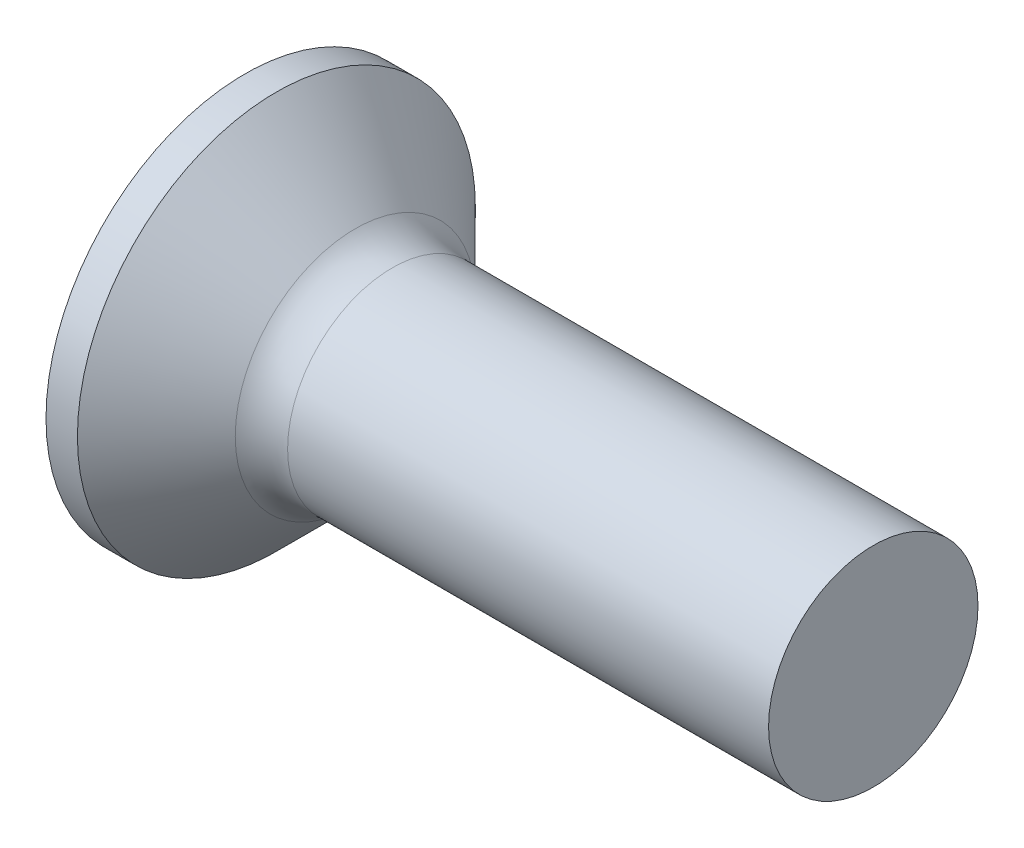
ISO-10303-21;
HEADER;
FILE_DESCRIPTION(('STEP AP214'),'2;1');
FILE_NAME('part.step','',(''),(''),'','','');
FILE_SCHEMA(('AUTOMOTIVE_DESIGN { 1 0 10303 214 1 1 1 1 }'));
ENDSEC;
DATA;
#1=APPLICATION_CONTEXT('core data for automotive mechanical design processes');
#2=APPLICATION_PROTOCOL_DEFINITION('international standard','automotive_design',2000,#1);
#3=PRODUCT_CONTEXT('',#1,'mechanical');
#4=PRODUCT('Part','Part','',(#3));
#5=PRODUCT_RELATED_PRODUCT_CATEGORY('part','',(#4));
#6=PRODUCT_DEFINITION_FORMATION('','',#4);
#7=PRODUCT_DEFINITION_CONTEXT('part definition',#1,'design');
#8=PRODUCT_DEFINITION('design','',#6,#7);
#9=PRODUCT_DEFINITION_SHAPE('','',#8);
#10=(LENGTH_UNIT() NAMED_UNIT(*) SI_UNIT(.MILLI.,.METRE.));
#11=(NAMED_UNIT(*) PLANE_ANGLE_UNIT() SI_UNIT($,.RADIAN.));
#12=(NAMED_UNIT(*) SI_UNIT($,.STERADIAN.) SOLID_ANGLE_UNIT());
#13=UNCERTAINTY_MEASURE_WITH_UNIT(LENGTH_MEASURE(1.E-05),#10,'distance_accuracy_value','');
#14=(GEOMETRIC_REPRESENTATION_CONTEXT(3) GLOBAL_UNCERTAINTY_ASSIGNED_CONTEXT((#13)) GLOBAL_UNIT_ASSIGNED_CONTEXT((#10,
#11,#12)) REPRESENTATION_CONTEXT('',''));
#15=CARTESIAN_POINT('',(0.,0.,0.));
#16=DIRECTION('',(0.,0.,1.));
#17=DIRECTION('',(1.,0.,0.));
#18=AXIS2_PLACEMENT_3D('',#15,#16,#17);
#19=CARTESIAN_POINT('',(0.,0.,0.));
#20=DIRECTION('',(-1.,0.,0.));
#21=DIRECTION('',(0.,0.,1.));
#22=AXIS2_PLACEMENT_3D('',#19,#20,#21);
#23=PLANE('',#22);
#24=CARTESIAN_POINT('',(0.,0.,0.));
#25=DIRECTION('',(-1.,0.,0.));
#26=DIRECTION('',(0.,0.,1.));
#27=AXIS2_PLACEMENT_3D('',#24,#25,#26);
#28=CIRCLE('',#27,1.9);
#29=CARTESIAN_POINT('',(0.,0.,1.9));
#30=VERTEX_POINT('',#29);
#31=EDGE_CURVE('E342',#30,#30,#28,.T.);
#32=ORIENTED_EDGE('',*,*,#31,.T.);
#33=EDGE_LOOP('',(#32));
#34=FACE_BOUND('',#33,.T.);
#35=DIRECTION('',(0.,0.,-1.));
#36=VECTOR('',#35,1.);
#37=CARTESIAN_POINT('',(0.,-0.240000000000003,0.95));
#38=LINE('',#37,#36);
#39=CARTESIAN_POINT('',(0.,-0.240000000000003,0.95));
#40=VERTEX_POINT('',#39);
#41=CARTESIAN_POINT('',(0.,-0.240000000000001,0.368080234393744));
#42=VERTEX_POINT('',#41);
#43=EDGE_CURVE('E381',#40,#42,#38,.T.);
#44=ORIENTED_EDGE('',*,*,#43,.T.);
#45=CARTESIAN_POINT('',(0.,0.,0.));
#46=DIRECTION('',(-1.,0.,0.));
#47=DIRECTION('',(0.,0.,1.));
#48=AXIS2_PLACEMENT_3D('',#45,#46,#47);
#49=CIRCLE('',#48,0.439412174332203);
#50=CARTESIAN_POINT('',(0.,-0.368080234393745,0.24));
#51=VERTEX_POINT('',#50);
#52=EDGE_CURVE('E368',#51,#42,#49,.T.);
#53=ORIENTED_EDGE('',*,*,#52,.F.);
#54=DIRECTION('',(0.,-1.,0.));
#55=VECTOR('',#54,1.);
#56=CARTESIAN_POINT('',(0.,0.95,0.24));
#57=LINE('',#56,#55);
#58=CARTESIAN_POINT('',(0.,-0.949999999999999,0.24));
#59=VERTEX_POINT('',#58);
#60=EDGE_CURVE('E428',#51,#59,#57,.T.);
#61=ORIENTED_EDGE('',*,*,#60,.T.);
#62=DIRECTION('',(0.,0.,-1.));
#63=VECTOR('',#62,1.);
#64=CARTESIAN_POINT('',(0.,-0.949999999999999,0.24));
#65=LINE('',#64,#63);
#66=CARTESIAN_POINT('',(0.,-0.949999999999999,-0.239999999999999));
#67=VERTEX_POINT('',#66);
#68=EDGE_CURVE('E339',#59,#67,#65,.T.);
#69=ORIENTED_EDGE('',*,*,#68,.T.);
#70=DIRECTION('',(0.,1.,0.));
#71=VECTOR('',#70,1.);
#72=CARTESIAN_POINT('',(0.,-0.949999999999999,-0.239999999999999));
#73=LINE('',#72,#71);
#74=CARTESIAN_POINT('',(0.,-0.368080234393745,-0.239999999999999));
#75=VERTEX_POINT('',#74);
#76=EDGE_CURVE('E429',#67,#75,#73,.T.);
#77=ORIENTED_EDGE('',*,*,#76,.T.);
#78=CARTESIAN_POINT('',(0.,-0.239999999999999,-0.368080234393746));
#79=VERTEX_POINT('',#78);
#80=EDGE_CURVE('E374',#79,#75,#49,.T.);
#81=ORIENTED_EDGE('',*,*,#80,.F.);
#82=CARTESIAN_POINT('',(0.,-0.239999999999997,-0.95));
#83=VERTEX_POINT('',#82);
#84=EDGE_CURVE('E390',#79,#83,#38,.T.);
#85=ORIENTED_EDGE('',*,*,#84,.T.);
#86=DIRECTION('',(0.,1.,0.));
#87=VECTOR('',#86,1.);
#88=CARTESIAN_POINT('',(0.,-0.239999999999997,-0.95));
#89=LINE('',#88,#87);
#90=CARTESIAN_POINT('',(0.,0.240000000000003,-0.949999999999998));
#91=VERTEX_POINT('',#90);
#92=EDGE_CURVE('E389',#83,#91,#89,.T.);
#93=ORIENTED_EDGE('',*,*,#92,.T.);
#94=DIRECTION('',(0.,0.,1.));
#95=VECTOR('',#94,1.);
#96=CARTESIAN_POINT('',(0.,0.240000000000003,-0.949999999999998));
#97=LINE('',#96,#95);
#98=CARTESIAN_POINT('',(0.,0.240000000000001,-0.368080234393744));
#99=VERTEX_POINT('',#98);
#100=EDGE_CURVE('E396',#91,#99,#97,.T.);
#101=ORIENTED_EDGE('',*,*,#100,.T.);
#102=CARTESIAN_POINT('',(0.,0.368080234393745,-0.239999999999999));
#103=VERTEX_POINT('',#102);
#104=EDGE_CURVE('E464',#103,#99,#49,.T.);
#105=ORIENTED_EDGE('',*,*,#104,.F.);
#106=CARTESIAN_POINT('',(0.,0.95,-0.239999999999999));
#107=VERTEX_POINT('',#106);
#108=EDGE_CURVE('E437',#103,#107,#73,.T.);
#109=ORIENTED_EDGE('',*,*,#108,.T.);
#110=DIRECTION('',(0.,0.,1.));
#111=VECTOR('',#110,1.);
#112=CARTESIAN_POINT('',(0.,0.95,-0.239999999999999));
#113=LINE('',#112,#111);
#114=CARTESIAN_POINT('',(0.,0.95,0.24));
#115=VERTEX_POINT('',#114);
#116=EDGE_CURVE('E425',#107,#115,#113,.T.);
#117=ORIENTED_EDGE('',*,*,#116,.T.);
#118=CARTESIAN_POINT('',(0.,0.368080234393745,0.24));
#119=VERTEX_POINT('',#118);
#120=EDGE_CURVE('E430',#115,#119,#57,.T.);
#121=ORIENTED_EDGE('',*,*,#120,.T.);
#122=CARTESIAN_POINT('',(0.,0.239999999999998,0.368080234393746));
#123=VERTEX_POINT('',#122);
#124=EDGE_CURVE('E376',#123,#119,#49,.T.);
#125=ORIENTED_EDGE('',*,*,#124,.F.);
#126=CARTESIAN_POINT('',(0.,0.239999999999996,0.950000000000001));
#127=VERTEX_POINT('',#126);
#128=EDGE_CURVE('E399',#123,#127,#97,.T.);
#129=ORIENTED_EDGE('',*,*,#128,.T.);
#130=DIRECTION('',(0.,-1.,0.));
#131=VECTOR('',#130,1.);
#132=CARTESIAN_POINT('',(0.,0.239999999999996,0.950000000000001));
#133=LINE('',#132,#131);
#134=EDGE_CURVE('E388',#127,#40,#133,.T.);
#135=ORIENTED_EDGE('',*,*,#134,.T.);
#136=EDGE_LOOP('',(#44,#53,#61,#69,#77,#81,#85,#93,#101,#105,#109,#117,#121,#125,#129,#135));
#137=FACE_BOUND('',#136,.T.);
#138=ADVANCED_FACE('F35',(#34,#137),#23,.T.);
#139=CARTESIAN_POINT('',(1.2,-0.35170209098021,0.24));
#140=DIRECTION('',(0.,0.,-1.));
#141=DIRECTION('',(-1.,0.,0.));
#142=AXIS2_PLACEMENT_3D('',#139,#140,#141);
#143=PLANE('',#142);
#144=ORIENTED_EDGE('',*,*,#60,.F.);
#145=CARTESIAN_POINT('',(-0.647693210410766,-0.421114336989015,0.24));
#146=CARTESIAN_POINT('',(-0.514503449530111,-0.410390261082206,0.24));
#147=CARTESIAN_POINT('',(-0.381320940222105,-0.399574318209683,0.24));
#148=CARTESIAN_POINT('',(-0.114973765651316,-0.377686644383827,0.24));
#149=CARTESIAN_POINT('',(0.0181908991098696,-0.36661490733336,0.24));
#150=CARTESIAN_POINT('',(0.284492634009301,-0.344144100394437,0.24));
#151=CARTESIAN_POINT('',(0.417629704158519,-0.332745030636382,0.24));
#152=CARTESIAN_POINT('',(0.683863247571634,-0.309504122508586,0.24));
#153=CARTESIAN_POINT('',(0.816959721449588,-0.297662291208839,0.24));
#154=CARTESIAN_POINT('',(1.04303435436914,-0.277010154535522,0.24));
#155=CARTESIAN_POINT('',(1.13602713244054,-0.268360479227262,0.24));
#156=CARTESIAN_POINT('',(1.32197255818582,-0.250648380042692,0.24));
#157=CARTESIAN_POINT('',(1.41492520621454,-0.241585959894734,0.24));
#158=CARTESIAN_POINT('',(1.60078125424125,-0.222904447219643,0.24));
#159=CARTESIAN_POINT('',(1.69368465085292,-0.213285320436498,0.24));
#160=CARTESIAN_POINT('',(1.8793987441832,-0.193166747196933,0.24));
#161=CARTESIAN_POINT('',(1.97220943765284,-0.182667270911613,0.24));
#162=CARTESIAN_POINT('',(2.06495176785102,-0.171565852394699,0.24));
#163=B_SPLINE_CURVE_WITH_KNOTS('',3,(#145,#146,#147,#148,#149,#150,#151,#152,#153,#154,#155,
#156,#157,#158,#159,#160,#161,#162),.UNSPECIFIED.,.F.,.F.,(4,2,2,2,2,2,2,2,4),(0.,
0.400862588720512,0.801734742318302,1.20260673621982,1.60347233174809,1.88365413958718,
2.16383341702737,2.44402995319874,2.72423598711459),.UNSPECIFIED.);
#164=CARTESIAN_POINT('',(1.2,-0.262259890185287,0.240000000000001));
#165=VERTEX_POINT('',#164);
#166=EDGE_CURVE('E371',#51,#165,#163,.T.);
#167=ORIENTED_EDGE('',*,*,#166,.T.);
#168=DIRECTION('',(0.,-1.,0.));
#169=VECTOR('',#168,1.);
#170=CARTESIAN_POINT('',(1.2,0.351702090980209,0.24));
#171=LINE('',#170,#169);
#172=CARTESIAN_POINT('',(1.2,-0.35170209098021,0.24));
#173=VERTEX_POINT('',#172);
#174=EDGE_CURVE('E444',#165,#173,#171,.T.);
#175=ORIENTED_EDGE('',*,*,#174,.T.);
#176=DIRECTION('',(0.894934367749961,0.446197800778957,0.));
#177=VECTOR('',#176,1.);
#178=CARTESIAN_POINT('',(0.,-0.949999999999999,0.24));
#179=LINE('',#178,#177);
#180=EDGE_CURVE('E317',#59,#173,#179,.T.);
#181=ORIENTED_EDGE('',*,*,#180,.F.);
#182=EDGE_LOOP('',(#144,#167,#175,#181));
#183=FACE_BOUND('',#182,.T.);
#184=ADVANCED_FACE('F189',(#183),#143,.T.);
#185=CARTESIAN_POINT('',(1.2,0.351702090980209,0.24));
#186=VERTEX_POINT('',#185);
#187=CARTESIAN_POINT('',(1.2,0.262259890185287,0.240000000000001));
#188=VERTEX_POINT('',#187);
#189=EDGE_CURVE('E326',#186,#188,#171,.T.);
#190=ORIENTED_EDGE('',*,*,#189,.T.);
#191=CARTESIAN_POINT('',(-0.647693210410766,0.421114336989016,0.24));
#192=CARTESIAN_POINT('',(-0.514503449530111,0.410390261082206,0.24));
#193=CARTESIAN_POINT('',(-0.381320940222105,0.399574318209683,0.24));
#194=CARTESIAN_POINT('',(-0.114973765651316,0.377686644383827,0.24));
#195=CARTESIAN_POINT('',(0.01819089910987,0.36661490733336,0.24));
#196=CARTESIAN_POINT('',(0.284492634009302,0.344144100394437,0.24));
#197=CARTESIAN_POINT('',(0.417629704158519,0.332745030636382,0.24));
#198=CARTESIAN_POINT('',(0.683863247571635,0.309504122508586,0.24));
#199=CARTESIAN_POINT('',(0.816959721449588,0.29766229120884,0.24));
#200=CARTESIAN_POINT('',(1.04303435436914,0.277010154535522,0.24));
#201=CARTESIAN_POINT('',(1.13602713244054,0.268360479227262,0.24));
#202=CARTESIAN_POINT('',(1.32197255818582,0.250648380042692,0.24));
#203=CARTESIAN_POINT('',(1.41492520621454,0.241585959894734,0.24));
#204=CARTESIAN_POINT('',(1.60078125424125,0.222904447219643,0.24));
#205=CARTESIAN_POINT('',(1.69368465085292,0.213285320436498,0.24));
#206=CARTESIAN_POINT('',(1.8793987441832,0.193166747196933,0.24));
#207=CARTESIAN_POINT('',(1.97220943765284,0.182667270911613,0.24));
#208=CARTESIAN_POINT('',(2.06495176785102,0.171565852394699,0.24));
#209=B_SPLINE_CURVE_WITH_KNOTS('',3,(#191,#192,#193,#194,#195,#196,#197,#198,#199,#200,#201,
#202,#203,#204,#205,#206,#207,#208),.UNSPECIFIED.,.F.,.F.,(4,2,2,2,2,2,2,2,4),(0.,
0.400862588720512,0.801734742318302,1.20260673621982,1.60347233174809,1.88365413958718,
2.16383341702737,2.44402995319874,2.72423598711459),.UNSPECIFIED.);
#210=EDGE_CURVE('E249',#188,#119,#209,.F.);
#211=ORIENTED_EDGE('',*,*,#210,.T.);
#212=ORIENTED_EDGE('',*,*,#120,.F.);
#213=DIRECTION('',(0.89493436774996,-0.446197800778958,0.));
#214=VECTOR('',#213,1.);
#215=CARTESIAN_POINT('',(0.,0.95,0.24));
#216=LINE('',#215,#214);
#217=EDGE_CURVE('E58',#115,#186,#216,.T.);
#218=ORIENTED_EDGE('',*,*,#217,.T.);
#219=EDGE_LOOP('',(#190,#211,#212,#218));
#220=FACE_BOUND('',#219,.T.);
#221=ADVANCED_FACE('F194',(#220),#143,.T.);
#222=CARTESIAN_POINT('',(1.2,0.351702090980209,-0.24));
#223=DIRECTION('',(0.,0.,1.));
#224=DIRECTION('',(1.,0.,0.));
#225=AXIS2_PLACEMENT_3D('',#222,#223,#224);
#226=PLANE('',#225);
#227=DIRECTION('',(0.,1.,0.));
#228=VECTOR('',#227,1.);
#229=CARTESIAN_POINT('',(1.2,-0.35170209098021,-0.24));
#230=LINE('',#229,#228);
#231=CARTESIAN_POINT('',(1.2,-0.35170209098021,-0.24));
#232=VERTEX_POINT('',#231);
#233=CARTESIAN_POINT('',(1.2,-0.262259890185287,-0.24));
#234=VERTEX_POINT('',#233);
#235=EDGE_CURVE('E330',#232,#234,#230,.T.);
#236=ORIENTED_EDGE('',*,*,#235,.T.);
#237=CARTESIAN_POINT('',(-0.647693210410766,-0.421114336989016,-0.239999999999999));
#238=CARTESIAN_POINT('',(-0.514503449530111,-0.410390261082207,-0.239999999999999));
#239=CARTESIAN_POINT('',(-0.381320940222105,-0.399574318209683,-0.239999999999999));
#240=CARTESIAN_POINT('',(-0.114973765651316,-0.377686644383827,-0.239999999999999));
#241=CARTESIAN_POINT('',(0.0181908991098698,-0.36661490733336,-0.239999999999999));
#242=CARTESIAN_POINT('',(0.284492634009301,-0.344144100394437,-0.239999999999999));
#243=CARTESIAN_POINT('',(0.417629704158519,-0.332745030636383,-0.24));
#244=CARTESIAN_POINT('',(0.683863247571635,-0.309504122508587,-0.24));
#245=CARTESIAN_POINT('',(0.816959721449588,-0.29766229120884,-0.24));
#246=CARTESIAN_POINT('',(1.04303435436914,-0.277010154535522,-0.24));
#247=CARTESIAN_POINT('',(1.13602713244054,-0.268360479227262,-0.24));
#248=CARTESIAN_POINT('',(1.32197255818582,-0.250648380042692,-0.24));
#249=CARTESIAN_POINT('',(1.41492520621454,-0.241585959894734,-0.24));
#250=CARTESIAN_POINT('',(1.60078125424125,-0.222904447219643,-0.24));
#251=CARTESIAN_POINT('',(1.69368465085292,-0.213285320436498,-0.24));
#252=CARTESIAN_POINT('',(1.8793987441832,-0.193166747196933,-0.24));
#253=CARTESIAN_POINT('',(1.97220943765284,-0.182667270911613,-0.24));
#254=CARTESIAN_POINT('',(2.06495176785102,-0.171565852394699,-0.24));
#255=B_SPLINE_CURVE_WITH_KNOTS('',3,(#237,#238,#239,#240,#241,#242,#243,#244,#245,#246,#247,
#248,#249,#250,#251,#252,#253,#254),.UNSPECIFIED.,.F.,.F.,(4,2,2,2,2,2,2,2,4),(0.,
0.400862588720512,0.801734742318302,1.20260673621982,1.60347233174809,1.88365413958718,
2.16383341702737,2.44402995319874,2.72423598711459),.UNSPECIFIED.);
#256=EDGE_CURVE('E243',#234,#75,#255,.F.);
#257=ORIENTED_EDGE('',*,*,#256,.T.);
#258=ORIENTED_EDGE('',*,*,#76,.F.);
#259=DIRECTION('',(0.894934367749961,0.446197800778957,0.));
#260=VECTOR('',#259,1.);
#261=CARTESIAN_POINT('',(0.,-0.949999999999999,-0.239999999999999));
#262=LINE('',#261,#260);
#263=EDGE_CURVE('E439',#67,#232,#262,.T.);
#264=ORIENTED_EDGE('',*,*,#263,.T.);
#265=EDGE_LOOP('',(#236,#257,#258,#264));
#266=FACE_BOUND('',#265,.T.);
#267=ADVANCED_FACE('F229',(#266),#226,.T.);
#268=ORIENTED_EDGE('',*,*,#108,.F.);
#269=CARTESIAN_POINT('',(-0.647693210410766,0.421114336989016,-0.239999999999999));
#270=CARTESIAN_POINT('',(-0.514503449530111,0.410390261082207,-0.239999999999999));
#271=CARTESIAN_POINT('',(-0.381320940222105,0.399574318209683,-0.239999999999999));
#272=CARTESIAN_POINT('',(-0.114973765651316,0.377686644383827,-0.239999999999999));
#273=CARTESIAN_POINT('',(0.0181908991098698,0.36661490733336,-0.239999999999999));
#274=CARTESIAN_POINT('',(0.284492634009301,0.344144100394437,-0.239999999999999));
#275=CARTESIAN_POINT('',(0.417629704158519,0.332745030636383,-0.24));
#276=CARTESIAN_POINT('',(0.683863247571635,0.309504122508587,-0.24));
#277=CARTESIAN_POINT('',(0.816959721449588,0.29766229120884,-0.24));
#278=CARTESIAN_POINT('',(1.04303435436914,0.277010154535523,-0.24));
#279=CARTESIAN_POINT('',(1.13602713244054,0.268360479227262,-0.24));
#280=CARTESIAN_POINT('',(1.32197255818582,0.250648380042692,-0.24));
#281=CARTESIAN_POINT('',(1.41492520621454,0.241585959894734,-0.24));
#282=CARTESIAN_POINT('',(1.60078125424125,0.222904447219643,-0.24));
#283=CARTESIAN_POINT('',(1.69368465085292,0.213285320436498,-0.24));
#284=CARTESIAN_POINT('',(1.8793987441832,0.193166747196933,-0.24));
#285=CARTESIAN_POINT('',(1.97220943765284,0.182667270911613,-0.24));
#286=CARTESIAN_POINT('',(2.06495176785102,0.171565852394699,-0.24));
#287=B_SPLINE_CURVE_WITH_KNOTS('',3,(#269,#270,#271,#272,#273,#274,#275,#276,#277,#278,#279,
#280,#281,#282,#283,#284,#285,#286),.UNSPECIFIED.,.F.,.F.,(4,2,2,2,2,2,2,2,4),(0.,
0.400862588720512,0.801734742318302,1.20260673621982,1.60347233174809,1.88365413958718,
2.16383341702737,2.44402995319874,2.72423598711459),.UNSPECIFIED.);
#288=CARTESIAN_POINT('',(1.2,0.262259890185287,-0.24));
#289=VERTEX_POINT('',#288);
#290=EDGE_CURVE('E237',#103,#289,#287,.T.);
#291=ORIENTED_EDGE('',*,*,#290,.T.);
#292=CARTESIAN_POINT('',(1.2,0.351702090980209,-0.24));
#293=VERTEX_POINT('',#292);
#294=EDGE_CURVE('E334',#289,#293,#230,.T.);
#295=ORIENTED_EDGE('',*,*,#294,.T.);
#296=DIRECTION('',(0.89493436774996,-0.446197800778958,0.));
#297=VECTOR('',#296,1.);
#298=CARTESIAN_POINT('',(0.,0.95,-0.239999999999999));
#299=LINE('',#298,#297);
#300=EDGE_CURVE('E321',#107,#293,#299,.T.);
#301=ORIENTED_EDGE('',*,*,#300,.F.);
#302=EDGE_LOOP('',(#268,#291,#295,#301));
#303=FACE_BOUND('',#302,.T.);
#304=ADVANCED_FACE('F221',(#303),#226,.T.);
#305=CARTESIAN_POINT('',(1.2,0.351702090980209,-0.24));
#306=DIRECTION('',(1.,0.,0.));
#307=DIRECTION('',(0.,0.,-1.));
#308=AXIS2_PLACEMENT_3D('',#305,#306,#307);
#309=PLANE('',#308);
#310=CARTESIAN_POINT('',(1.2,0.,0.));
#311=DIRECTION('',(-1.,0.,0.));
#312=DIRECTION('',(0.,0.,1.));
#313=AXIS2_PLACEMENT_3D('',#310,#311,#312);
#314=CIRCLE('',#313,0.355499999999999);
#315=CARTESIAN_POINT('',(1.2,-0.0518255651213496,-0.35170209098021));
#316=VERTEX_POINT('',#315);
#317=CARTESIAN_POINT('',(1.2,-0.239999999999999,-0.262259890185288));
#318=VERTEX_POINT('',#317);
#319=EDGE_CURVE('E511',#316,#318,#314,.T.);
#320=ORIENTED_EDGE('',*,*,#319,.F.);
#321=DIRECTION('',(0.,1.,0.));
#322=VECTOR('',#321,1.);
#323=CARTESIAN_POINT('',(1.2,-0.239999999999999,-0.35170209098021));
#324=LINE('',#323,#322);
#325=CARTESIAN_POINT('',(1.2,-0.239999999999999,-0.35170209098021));
#326=VERTEX_POINT('',#325);
#327=EDGE_CURVE('E411',#326,#316,#324,.T.);
#328=ORIENTED_EDGE('',*,*,#327,.F.);
#329=DIRECTION('',(0.,0.,-1.));
#330=VECTOR('',#329,1.);
#331=CARTESIAN_POINT('',(1.2,-0.240000000000001,0.351702090980208));
#332=LINE('',#331,#330);
#333=EDGE_CURVE('E415',#318,#326,#332,.T.);
#334=ORIENTED_EDGE('',*,*,#333,.F.);
#335=EDGE_LOOP('',(#320,#328,#334));
#336=FACE_BOUND('',#335,.T.);
#337=ADVANCED_FACE('F217',(#336),#309,.F.);
#338=CARTESIAN_POINT('',(1.2,-0.35170209098021,-0.0518255651213508));
#339=VERTEX_POINT('',#338);
#340=EDGE_CURVE('E482',#234,#339,#314,.T.);
#341=ORIENTED_EDGE('',*,*,#340,.F.);
#342=ORIENTED_EDGE('',*,*,#235,.F.);
#343=DIRECTION('',(0.,0.,-1.));
#344=VECTOR('',#343,1.);
#345=CARTESIAN_POINT('',(1.2,-0.35170209098021,0.24));
#346=LINE('',#345,#344);
#347=EDGE_CURVE('E322',#339,#232,#346,.T.);
#348=ORIENTED_EDGE('',*,*,#347,.F.);
#349=EDGE_LOOP('',(#341,#342,#348));
#350=FACE_BOUND('',#349,.T.);
#351=ADVANCED_FACE('F220',(#350),#309,.F.);
#352=CARTESIAN_POINT('',(1.2,-0.35170209098021,0.0518255651213508));
#353=VERTEX_POINT('',#352);
#354=EDGE_CURVE('E478',#353,#165,#314,.T.);
#355=ORIENTED_EDGE('',*,*,#354,.F.);
#356=EDGE_CURVE('E312',#173,#353,#346,.T.);
#357=ORIENTED_EDGE('',*,*,#356,.F.);
#358=ORIENTED_EDGE('',*,*,#174,.F.);
#359=EDGE_LOOP('',(#355,#357,#358));
#360=FACE_BOUND('',#359,.T.);
#361=ADVANCED_FACE('F476',(#360),#309,.F.);
#362=CARTESIAN_POINT('',(1.2,-0.240000000000001,0.262259890185287));
#363=VERTEX_POINT('',#362);
#364=CARTESIAN_POINT('',(1.2,-0.0518255651213507,0.351702090980209));
#365=VERTEX_POINT('',#364);
#366=EDGE_CURVE('E50',#363,#365,#314,.T.);
#367=ORIENTED_EDGE('',*,*,#366,.F.);
#368=CARTESIAN_POINT('',(1.2,-0.240000000000001,0.351702090980208));
#369=VERTEX_POINT('',#368);
#370=EDGE_CURVE('E384',#369,#363,#332,.T.);
#371=ORIENTED_EDGE('',*,*,#370,.F.);
#372=DIRECTION('',(0.,-1.,0.));
#373=VECTOR('',#372,1.);
#374=CARTESIAN_POINT('',(1.2,0.239999999999999,0.35170209098021));
#375=LINE('',#374,#373);
#376=EDGE_CURVE('E416',#365,#369,#375,.T.);
#377=ORIENTED_EDGE('',*,*,#376,.F.);
#378=EDGE_LOOP('',(#367,#371,#377));
#379=FACE_BOUND('',#378,.T.);
#380=ADVANCED_FACE('F522',(#379),#309,.F.);
#381=CARTESIAN_POINT('',(1.2,0.0518255651213529,0.351702090980209));
#382=VERTEX_POINT('',#381);
#383=CARTESIAN_POINT('',(1.2,0.239999999999999,0.262259890185289));
#384=VERTEX_POINT('',#383);
#385=EDGE_CURVE('E375',#382,#384,#314,.T.);
#386=ORIENTED_EDGE('',*,*,#385,.F.);
#387=CARTESIAN_POINT('',(1.2,0.239999999999999,0.35170209098021));
#388=VERTEX_POINT('',#387);
#389=EDGE_CURVE('E412',#388,#382,#375,.T.);
#390=ORIENTED_EDGE('',*,*,#389,.F.);
#391=DIRECTION('',(0.,0.,1.));
#392=VECTOR('',#391,1.);
#393=CARTESIAN_POINT('',(1.2,0.240000000000001,-0.351702090980209));
#394=LINE('',#393,#392);
#395=EDGE_CURVE('E424',#384,#388,#394,.T.);
#396=ORIENTED_EDGE('',*,*,#395,.F.);
#397=EDGE_LOOP('',(#386,#390,#396));
#398=FACE_BOUND('',#397,.T.);
#399=ADVANCED_FACE('F487',(#398),#309,.F.);
#400=CARTESIAN_POINT('',(1.2,0.351702090980209,0.0518255651213541));
#401=VERTEX_POINT('',#400);
#402=EDGE_CURVE('E456',#188,#401,#314,.T.);
#403=ORIENTED_EDGE('',*,*,#402,.F.);
#404=ORIENTED_EDGE('',*,*,#189,.F.);
#405=DIRECTION('',(0.,0.,1.));
#406=VECTOR('',#405,1.);
#407=CARTESIAN_POINT('',(1.2,0.351702090980209,-0.24));
#408=LINE('',#407,#406);
#409=EDGE_CURVE('E333',#401,#186,#408,.T.);
#410=ORIENTED_EDGE('',*,*,#409,.F.);
#411=EDGE_LOOP('',(#403,#404,#410));
#412=FACE_BOUND('',#411,.T.);
#413=ADVANCED_FACE('F454',(#412),#309,.F.);
#414=CARTESIAN_POINT('',(1.2,0.351702090980209,-0.0518255651213541));
#415=VERTEX_POINT('',#414);
#416=EDGE_CURVE('E462',#415,#289,#314,.T.);
#417=ORIENTED_EDGE('',*,*,#416,.F.);
#418=EDGE_CURVE('E442',#293,#415,#408,.T.);
#419=ORIENTED_EDGE('',*,*,#418,.F.);
#420=ORIENTED_EDGE('',*,*,#294,.F.);
#421=EDGE_LOOP('',(#417,#419,#420));
#422=FACE_BOUND('',#421,.T.);
#423=ADVANCED_FACE('F306',(#422),#309,.F.);
#424=CARTESIAN_POINT('',(1.2,0.240000000000001,-0.262259890185287));
#425=VERTEX_POINT('',#424);
#426=CARTESIAN_POINT('',(1.2,0.051825565121352,-0.35170209098021));
#427=VERTEX_POINT('',#426);
#428=EDGE_CURVE('E505',#425,#427,#314,.T.);
#429=ORIENTED_EDGE('',*,*,#428,.F.);
#430=CARTESIAN_POINT('',(1.2,0.240000000000001,-0.351702090980209));
#431=VERTEX_POINT('',#430);
#432=EDGE_CURVE('E421',#431,#425,#394,.T.);
#433=ORIENTED_EDGE('',*,*,#432,.F.);
#434=EDGE_CURVE('E418',#427,#431,#324,.T.);
#435=ORIENTED_EDGE('',*,*,#434,.F.);
#436=EDGE_LOOP('',(#429,#433,#435));
#437=FACE_BOUND('',#436,.T.);
#438=ADVANCED_FACE('F223',(#437),#309,.F.);
#439=CARTESIAN_POINT('',(1.2,-0.35170209098021,-0.24));
#440=DIRECTION('',(-0.446197800778957,0.894934367749961,0.));
#441=DIRECTION('',(-0.894934367749961,-0.446197800778957,0.));
#442=AXIS2_PLACEMENT_3D('',#439,#440,#441);
#443=PLANE('',#442);
#444=ORIENTED_EDGE('',*,*,#356,.T.);
#445=CARTESIAN_POINT('',(1.81755030037573,-0.0438028797890923,0.));
#446=DIRECTION('',(-0.446197800778957,0.894934367749961,0.));
#447=DIRECTION('',(-0.894934367749961,-0.446197800778957,0.));
#448=AXIS2_PLACEMENT_3D('',#445,#446,#447);
#449=ELLIPSE('',#448,0.699951178008363,0.309229710740658);
#450=EDGE_CURVE('E313',#353,#339,#449,.F.);
#451=ORIENTED_EDGE('',*,*,#450,.T.);
#452=ORIENTED_EDGE('',*,*,#347,.T.);
#453=ORIENTED_EDGE('',*,*,#263,.F.);
#454=ORIENTED_EDGE('',*,*,#68,.F.);
#455=ORIENTED_EDGE('',*,*,#180,.T.);
#456=EDGE_LOOP('',(#444,#451,#452,#453,#454,#455));
#457=FACE_BOUND('',#456,.T.);
#458=ADVANCED_FACE('F228',(#457),#443,.T.);
#459=CARTESIAN_POINT('',(0.,0.95,0.24));
#460=DIRECTION('',(-0.446197800778958,-0.89493436774996,0.));
#461=DIRECTION('',(0.89493436774996,-0.446197800778958,0.));
#462=AXIS2_PLACEMENT_3D('',#459,#460,#461);
#463=PLANE('',#462);
#464=ORIENTED_EDGE('',*,*,#418,.T.);
#465=CARTESIAN_POINT('',(1.81755030037572,0.0438028797890925,0.));
#466=DIRECTION('',(-0.446197800778958,-0.89493436774996,0.));
#467=DIRECTION('',(-0.89493436774996,0.446197800778958,0.));
#468=AXIS2_PLACEMENT_3D('',#465,#466,#467);
#469=ELLIPSE('',#468,0.699951178008361,0.309229710740658);
#470=EDGE_CURVE('E290',#415,#401,#469,.F.);
#471=ORIENTED_EDGE('',*,*,#470,.T.);
#472=ORIENTED_EDGE('',*,*,#409,.T.);
#473=ORIENTED_EDGE('',*,*,#217,.F.);
#474=ORIENTED_EDGE('',*,*,#116,.F.);
#475=ORIENTED_EDGE('',*,*,#300,.T.);
#476=EDGE_LOOP('',(#464,#471,#472,#473,#474,#475));
#477=FACE_BOUND('',#476,.T.);
#478=ADVANCED_FACE('F224',(#477),#463,.T.);
#479=CARTESIAN_POINT('',(1.2,0.239999999999999,0.35170209098021));
#480=DIRECTION('',(0.,-1.,0.));
#481=DIRECTION('',(1.,0.,0.));
#482=AXIS2_PLACEMENT_3D('',#479,#480,#481);
#483=PLANE('',#482);
#484=ORIENTED_EDGE('',*,*,#432,.T.);
#485=CARTESIAN_POINT('',(-0.647693210410766,0.24,-0.421114336989015));
#486=CARTESIAN_POINT('',(-0.514503449530111,0.24,-0.410390261082206));
#487=CARTESIAN_POINT('',(-0.381320940222105,0.240000000000001,-0.399574318209682));
#488=CARTESIAN_POINT('',(-0.114973765651316,0.240000000000001,-0.377686644383827));
#489=CARTESIAN_POINT('',(0.0181908991098697,0.240000000000001,-0.36661490733336));
#490=CARTESIAN_POINT('',(0.284492634009301,0.240000000000001,-0.344144100394436));
#491=CARTESIAN_POINT('',(0.417629704158519,0.240000000000001,-0.332745030636382));
#492=CARTESIAN_POINT('',(0.683863247571635,0.240000000000001,-0.309504122508586));
#493=CARTESIAN_POINT('',(0.816959721449588,0.240000000000001,-0.297662291208839));
#494=CARTESIAN_POINT('',(1.04303435436914,0.240000000000001,-0.277010154535522));
#495=CARTESIAN_POINT('',(1.13602713244054,0.240000000000001,-0.268360479227261));
#496=CARTESIAN_POINT('',(1.32197255818582,0.240000000000001,-0.250648380042692));
#497=CARTESIAN_POINT('',(1.41492520621454,0.240000000000001,-0.241585959894734));
#498=CARTESIAN_POINT('',(1.60078125424125,0.240000000000001,-0.222904447219642));
#499=CARTESIAN_POINT('',(1.69368465085292,0.240000000000001,-0.213285320436497));
#500=CARTESIAN_POINT('',(1.8793987441832,0.240000000000001,-0.193166747196932));
#501=CARTESIAN_POINT('',(1.97220943765284,0.240000000000001,-0.182667270911612));
#502=CARTESIAN_POINT('',(2.06495176785102,0.240000000000001,-0.171565852394698));
#503=B_SPLINE_CURVE_WITH_KNOTS('',3,(#485,#486,#487,#488,#489,#490,#491,#492,#493,#494,#495,
#496,#497,#498,#499,#500,#501,#502),.UNSPECIFIED.,.F.,.F.,(4,2,2,2,2,2,2,2,4),(0.,
0.400862588720512,0.801734742318302,1.20260673621982,1.60347233174809,1.88365413958718,
2.16383341702737,2.44402995319874,2.72423598711459),.UNSPECIFIED.);
#504=EDGE_CURVE('E283',#425,#99,#503,.F.);
#505=ORIENTED_EDGE('',*,*,#504,.T.);
#506=ORIENTED_EDGE('',*,*,#100,.F.);
#507=DIRECTION('',(0.894934367749961,0.,0.446197800778957));
#508=VECTOR('',#507,1.);
#509=CARTESIAN_POINT('',(0.,0.240000000000003,-0.949999999999998));
#510=LINE('',#509,#508);
#511=EDGE_CURVE('E403',#91,#431,#510,.T.);
#512=ORIENTED_EDGE('',*,*,#511,.T.);
#513=EDGE_LOOP('',(#484,#505,#506,#512));
#514=FACE_BOUND('',#513,.T.);
#515=ADVANCED_FACE('F227',(#514),#483,.T.);
#516=CARTESIAN_POINT('',(1.2,-0.239999999999999,-0.35170209098021));
#517=DIRECTION('',(0.,1.,0.));
#518=DIRECTION('',(-1.,0.,0.));
#519=AXIS2_PLACEMENT_3D('',#516,#517,#518);
#520=PLANE('',#519);
#521=ORIENTED_EDGE('',*,*,#84,.F.);
#522=CARTESIAN_POINT('',(-0.647693210421637,-0.239999999999998,-0.421114336989891));
#523=CARTESIAN_POINT('',(-0.514503449539821,-0.239999999999998,-0.410390261082994));
#524=CARTESIAN_POINT('',(-0.381320940230653,-0.239999999999999,-0.399574318210382));
#525=CARTESIAN_POINT('',(-0.114973765657541,-0.239999999999999,-0.377686644384344));
#526=CARTESIAN_POINT('',(0.0181908991048066,-0.239999999999999,-0.366614907333785));
#527=CARTESIAN_POINT('',(0.284492634007953,-0.239999999999999,-0.344144100394555));
#528=CARTESIAN_POINT('',(0.417629704159725,-0.239999999999999,-0.332745030636282));
#529=CARTESIAN_POINT('',(0.683863247577946,-0.239999999999999,-0.309504122508032));
#530=CARTESIAN_POINT('',(0.81695972145845,-0.239999999999999,-0.297662291208049));
#531=CARTESIAN_POINT('',(1.04303435438055,-0.239999999999999,-0.277010154534468));
#532=CARTESIAN_POINT('',(1.13602713245195,-0.239999999999999,-0.268360479226193));
#533=CARTESIAN_POINT('',(1.32197255819723,-0.239999999999999,-0.250648380041589));
#534=CARTESIAN_POINT('',(1.41492520622595,-0.24,-0.241585959893612));
#535=CARTESIAN_POINT('',(1.60078125425266,-0.24,-0.222904447218473));
#536=CARTESIAN_POINT('',(1.69368465086432,-0.24,-0.213285320435301));
#537=CARTESIAN_POINT('',(1.87939874419459,-0.24,-0.193166747195665));
#538=CARTESIAN_POINT('',(1.97220943766423,-0.24,-0.182667270910301));
#539=CARTESIAN_POINT('',(2.0649517678624,-0.24,-0.171565852393331));
#540=B_SPLINE_CURVE_WITH_KNOTS('',3,(#522,#523,#524,#525,#526,#527,#528,#529,#530,#531,#532,
#533,#534,#535,#536,#537,#538,#539),.UNSPECIFIED.,.F.,.F.,(4,2,2,2,2,2,2,2,4),(0.,
0.400862588724007,0.801734742325292,1.2026067362345,1.60347233177046,1.88365413960954,
2.16383341704974,2.4440299532211,2.72423598713696),.UNSPECIFIED.);
#541=EDGE_CURVE('E277',#79,#318,#540,.T.);
#542=ORIENTED_EDGE('',*,*,#541,.T.);
#543=ORIENTED_EDGE('',*,*,#333,.T.);
#544=DIRECTION('',(0.894934367749961,0.,0.446197800778957));
#545=VECTOR('',#544,1.);
#546=CARTESIAN_POINT('',(0.,-0.239999999999997,-0.95));
#547=LINE('',#546,#545);
#548=EDGE_CURVE('E400',#83,#326,#547,.T.);
#549=ORIENTED_EDGE('',*,*,#548,.F.);
#550=EDGE_LOOP('',(#521,#542,#543,#549));
#551=FACE_BOUND('',#550,.T.);
#552=ADVANCED_FACE('F294',(#551),#520,.T.);
#553=CARTESIAN_POINT('',(1.2,0.240000000000001,-0.351702090980209));
#554=DIRECTION('',(-0.446197800778957,0.,0.894934367749961));
#555=DIRECTION('',(-0.894934367749961,0.,-0.446197800778957));
#556=AXIS2_PLACEMENT_3D('',#553,#554,#555);
#557=PLANE('',#556);
#558=ORIENTED_EDGE('',*,*,#327,.T.);
#559=CARTESIAN_POINT('',(1.81755030037573,0.,-0.0438028797890923));
#560=DIRECTION('',(-0.446197800778957,0.,0.894934367749961));
#561=DIRECTION('',(-0.894934367749961,0.,-0.446197800778957));
#562=AXIS2_PLACEMENT_3D('',#559,#560,#561);
#563=ELLIPSE('',#562,0.699951178008363,0.309229710740658);
#564=EDGE_CURVE('E385',#316,#427,#563,.F.);
#565=ORIENTED_EDGE('',*,*,#564,.T.);
#566=ORIENTED_EDGE('',*,*,#434,.T.);
#567=ORIENTED_EDGE('',*,*,#511,.F.);
#568=ORIENTED_EDGE('',*,*,#92,.F.);
#569=ORIENTED_EDGE('',*,*,#548,.T.);
#570=EDGE_LOOP('',(#558,#565,#566,#567,#568,#569));
#571=FACE_BOUND('',#570,.T.);
#572=ADVANCED_FACE('F256',(#571),#557,.T.);
#573=ORIENTED_EDGE('',*,*,#370,.T.);
#574=CARTESIAN_POINT('',(-0.647693210410766,-0.240000000000001,0.421114336989015));
#575=CARTESIAN_POINT('',(-0.514503449530111,-0.240000000000001,0.410390261082206));
#576=CARTESIAN_POINT('',(-0.381320940222105,-0.240000000000001,0.399574318209682));
#577=CARTESIAN_POINT('',(-0.114973765651316,-0.240000000000001,0.377686644383826));
#578=CARTESIAN_POINT('',(0.0181908991098698,-0.240000000000001,0.366614907333359));
#579=CARTESIAN_POINT('',(0.284492634009301,-0.240000000000001,0.344144100394436));
#580=CARTESIAN_POINT('',(0.417629704158519,-0.240000000000001,0.332745030636382));
#581=CARTESIAN_POINT('',(0.683863247571635,-0.240000000000001,0.309504122508585));
#582=CARTESIAN_POINT('',(0.816959721449588,-0.240000000000001,0.297662291208839));
#583=CARTESIAN_POINT('',(1.04303435436914,-0.240000000000001,0.277010154535521));
#584=CARTESIAN_POINT('',(1.13602713244054,-0.240000000000001,0.268360479227261));
#585=CARTESIAN_POINT('',(1.32197255818582,-0.240000000000001,0.250648380042691));
#586=CARTESIAN_POINT('',(1.41492520621454,-0.240000000000001,0.241585959894733));
#587=CARTESIAN_POINT('',(1.60078125424125,-0.240000000000001,0.222904447219642));
#588=CARTESIAN_POINT('',(1.69368465085292,-0.240000000000001,0.213285320436497));
#589=CARTESIAN_POINT('',(1.8793987441832,-0.240000000000001,0.193166747196932));
#590=CARTESIAN_POINT('',(1.97220943765284,-0.240000000000001,0.182667270911612));
#591=CARTESIAN_POINT('',(2.06495176785102,-0.240000000000001,0.171565852394698));
#592=B_SPLINE_CURVE_WITH_KNOTS('',3,(#574,#575,#576,#577,#578,#579,#580,#581,#582,#583,#584,
#585,#586,#587,#588,#589,#590,#591),.UNSPECIFIED.,.F.,.F.,(4,2,2,2,2,2,2,2,4),(0.,
0.400862588720512,0.801734742318302,1.20260673621982,1.60347233174809,1.88365413958718,
2.16383341702737,2.44402995319874,2.72423598711459),.UNSPECIFIED.);
#593=EDGE_CURVE('E270',#363,#42,#592,.F.);
#594=ORIENTED_EDGE('',*,*,#593,.T.);
#595=ORIENTED_EDGE('',*,*,#43,.F.);
#596=DIRECTION('',(0.89493436774996,0.,-0.446197800778958));
#597=VECTOR('',#596,1.);
#598=CARTESIAN_POINT('',(0.,-0.240000000000003,0.95));
#599=LINE('',#598,#597);
#600=EDGE_CURVE('E406',#40,#369,#599,.T.);
#601=ORIENTED_EDGE('',*,*,#600,.T.);
#602=EDGE_LOOP('',(#573,#594,#595,#601));
#603=FACE_BOUND('',#602,.T.);
#604=ADVANCED_FACE('F379',(#603),#520,.T.);
#605=ORIENTED_EDGE('',*,*,#128,.F.);
#606=CARTESIAN_POINT('',(-0.647693210421637,0.239999999999998,0.421114336989892));
#607=CARTESIAN_POINT('',(-0.514503449539821,0.239999999999998,0.410390261082994));
#608=CARTESIAN_POINT('',(-0.381320940230653,0.239999999999998,0.399574318210382));
#609=CARTESIAN_POINT('',(-0.114973765657541,0.239999999999998,0.377686644384345));
#610=CARTESIAN_POINT('',(0.0181908991048067,0.239999999999998,0.366614907333785));
#611=CARTESIAN_POINT('',(0.284492634007954,0.239999999999998,0.344144100394555));
#612=CARTESIAN_POINT('',(0.417629704159725,0.239999999999998,0.332745030636282));
#613=CARTESIAN_POINT('',(0.683863247577946,0.239999999999999,0.309504122508032));
#614=CARTESIAN_POINT('',(0.816959721458451,0.239999999999999,0.297662291208049));
#615=CARTESIAN_POINT('',(1.04303435438055,0.239999999999999,0.277010154534468));
#616=CARTESIAN_POINT('',(1.13602713245195,0.239999999999999,0.268360479226193));
#617=CARTESIAN_POINT('',(1.32197255819723,0.239999999999999,0.250648380041589));
#618=CARTESIAN_POINT('',(1.41492520622595,0.239999999999999,0.241585959893612));
#619=CARTESIAN_POINT('',(1.60078125425266,0.239999999999999,0.222904447218473));
#620=CARTESIAN_POINT('',(1.69368465086432,0.24,0.213285320435301));
#621=CARTESIAN_POINT('',(1.87939874419459,0.24,0.193166747195665));
#622=CARTESIAN_POINT('',(1.97220943766423,0.24,0.182667270910302));
#623=CARTESIAN_POINT('',(2.0649517678624,0.24,0.171565852393331));
#624=B_SPLINE_CURVE_WITH_KNOTS('',3,(#606,#607,#608,#609,#610,#611,#612,#613,#614,#615,#616,
#617,#618,#619,#620,#621,#622,#623),.UNSPECIFIED.,.F.,.F.,(4,2,2,2,2,2,2,2,4),(0.,
0.400862588724006,0.801734742325292,1.2026067362345,1.60347233177046,1.88365413960954,
2.16383341704973,2.4440299532211,2.72423598713696),.UNSPECIFIED.);
#625=EDGE_CURVE('E261',#123,#384,#624,.T.);
#626=ORIENTED_EDGE('',*,*,#625,.T.);
#627=ORIENTED_EDGE('',*,*,#395,.T.);
#628=DIRECTION('',(0.89493436774996,0.,-0.446197800778958));
#629=VECTOR('',#628,1.);
#630=CARTESIAN_POINT('',(0.,0.239999999999996,0.950000000000001));
#631=LINE('',#630,#629);
#632=EDGE_CURVE('E408',#127,#388,#631,.T.);
#633=ORIENTED_EDGE('',*,*,#632,.F.);
#634=EDGE_LOOP('',(#605,#626,#627,#633));
#635=FACE_BOUND('',#634,.T.);
#636=ADVANCED_FACE('F296',(#635),#483,.T.);
#637=CARTESIAN_POINT('',(0.,-0.240000000000003,0.95));
#638=DIRECTION('',(-0.446197800778958,0.,-0.89493436774996));
#639=DIRECTION('',(0.89493436774996,0.,-0.446197800778958));
#640=AXIS2_PLACEMENT_3D('',#637,#638,#639);
#641=PLANE('',#640);
#642=ORIENTED_EDGE('',*,*,#389,.T.);
#643=CARTESIAN_POINT('',(1.81755030037572,0.,0.0438028797890925));
#644=DIRECTION('',(-0.446197800778958,0.,-0.89493436774996));
#645=DIRECTION('',(-0.89493436774996,0.,0.446197800778958));
#646=AXIS2_PLACEMENT_3D('',#643,#644,#645);
#647=ELLIPSE('',#646,0.699951178008361,0.309229710740658);
#648=EDGE_CURVE('E11',#382,#365,#647,.F.);
#649=ORIENTED_EDGE('',*,*,#648,.T.);
#650=ORIENTED_EDGE('',*,*,#376,.T.);
#651=ORIENTED_EDGE('',*,*,#600,.F.);
#652=ORIENTED_EDGE('',*,*,#134,.F.);
#653=ORIENTED_EDGE('',*,*,#632,.T.);
#654=EDGE_LOOP('',(#642,#649,#650,#651,#652,#653));
#655=FACE_BOUND('',#654,.T.);
#656=ADVANCED_FACE('F204',(#655),#641,.T.);
#657=CARTESIAN_POINT('',(-6.34999999999999,0.,0.));
#658=DIRECTION('',(-1.,0.,0.));
#659=DIRECTION('',(0.,0.,1.));
#660=AXIS2_PLACEMENT_3D('',#657,#658,#659);
#661=CYLINDRICAL_SURFACE('',#660,1.9);
#662=CARTESIAN_POINT('',(0.300000000000003,0.,0.));
#663=DIRECTION('',(-1.,0.,0.));
#664=DIRECTION('',(0.,0.,1.));
#665=AXIS2_PLACEMENT_3D('',#662,#663,#664);
#666=CIRCLE('',#665,1.9);
#667=CARTESIAN_POINT('',(0.300000000000003,0.,1.9));
#668=VERTEX_POINT('',#667);
#669=EDGE_CURVE('E338',#668,#668,#666,.T.);
#670=ORIENTED_EDGE('',*,*,#669,.T.);
#671=EDGE_LOOP('',(#670));
#672=FACE_BOUND('',#671,.T.);
#673=ORIENTED_EDGE('',*,*,#31,.F.);
#674=EDGE_LOOP('',(#673));
#675=FACE_BOUND('',#674,.T.);
#676=ADVANCED_FACE('F200',(#672,#675),#661,.T.);
#677=CARTESIAN_POINT('',(0.300000000000003,0.,0.));
#678=DIRECTION('',(-1.,0.,0.));
#679=DIRECTION('',(0.,0.,1.));
#680=AXIS2_PLACEMENT_3D('',#677,#678,#679);
#681=CONICAL_SURFACE('',#680,1.9,0.78539816339745);
#682=CARTESIAN_POINT('',(1.05355339059327,0.,0.));
#683=DIRECTION('',(-1.,0.,0.));
#684=DIRECTION('',(0.,0.,1.));
#685=AXIS2_PLACEMENT_3D('',#682,#683,#684);
#686=CIRCLE('',#685,1.14644660940673);
#687=CARTESIAN_POINT('',(1.05355339059327,0.,1.14644660940673));
#688=VERTEX_POINT('',#687);
#689=EDGE_CURVE('E344',#688,#688,#686,.T.);
#690=ORIENTED_EDGE('',*,*,#689,.T.);
#691=EDGE_LOOP('',(#690));
#692=FACE_BOUND('',#691,.T.);
#693=ORIENTED_EDGE('',*,*,#669,.F.);
#694=EDGE_LOOP('',(#693));
#695=FACE_BOUND('',#694,.T.);
#696=ADVANCED_FACE('F203',(#692,#695),#681,.T.);
#697=CARTESIAN_POINT('',(-6.34999999999999,0.,0.));
#698=DIRECTION('',(-1.,0.,0.));
#699=DIRECTION('',(0.,0.,1.));
#700=AXIS2_PLACEMENT_3D('',#697,#698,#699);
#701=CYLINDRICAL_SURFACE('',#700,1.);
#702=CARTESIAN_POINT('',(1.40710678118655,0.,0.));
#703=DIRECTION('',(-1.,0.,0.));
#704=DIRECTION('',(0.,0.,1.));
#705=AXIS2_PLACEMENT_3D('',#702,#703,#704);
#706=CIRCLE('',#705,1.);
#707=CARTESIAN_POINT('',(1.40710678118655,0.,1.));
#708=VERTEX_POINT('',#707);
#709=EDGE_CURVE('E43',#708,#708,#706,.F.);
#710=ORIENTED_EDGE('',*,*,#709,.T.);
#711=EDGE_LOOP('',(#710));
#712=FACE_BOUND('',#711,.T.);
#713=CARTESIAN_POINT('',(6.,0.,0.));
#714=DIRECTION('',(-1.,0.,0.));
#715=DIRECTION('',(0.,0.,1.));
#716=AXIS2_PLACEMENT_3D('',#713,#714,#715);
#717=CIRCLE('',#716,1.);
#718=CARTESIAN_POINT('',(6.,0.,1.));
#719=VERTEX_POINT('',#718);
#720=EDGE_CURVE('E335',#719,#719,#717,.T.);
#721=ORIENTED_EDGE('',*,*,#720,.T.);
#722=EDGE_LOOP('',(#721));
#723=FACE_BOUND('',#722,.T.);
#724=ADVANCED_FACE('F208',(#712,#723),#701,.T.);
#725=CARTESIAN_POINT('',(6.,1.,0.));
#726=DIRECTION('',(1.,0.,0.));
#727=DIRECTION('',(0.,0.,-1.));
#728=AXIS2_PLACEMENT_3D('',#725,#726,#727);
#729=PLANE('',#728);
#730=ORIENTED_EDGE('',*,*,#720,.F.);
#731=EDGE_LOOP('',(#730));
#732=FACE_BOUND('',#731,.T.);
#733=ADVANCED_FACE('F212',(#732),#729,.T.);
#734=CARTESIAN_POINT('',(1.40710678118655,0.,0.));
#735=DIRECTION('',(-1.,0.,0.));
#736=DIRECTION('',(0.,0.,1.));
#737=AXIS2_PLACEMENT_3D('',#734,#735,#736);
#738=TOROIDAL_SURFACE('',#737,1.5,0.5);
#739=ORIENTED_EDGE('',*,*,#709,.F.);
#740=EDGE_LOOP('',(#739));
#741=FACE_BOUND('',#740,.T.);
#742=ORIENTED_EDGE('',*,*,#689,.F.);
#743=EDGE_LOOP('',(#742));
#744=FACE_BOUND('',#743,.T.);
#745=ADVANCED_FACE('F37',(#741,#744),#738,.F.);
#746=CARTESIAN_POINT('',(1.2,0.,0.));
#747=DIRECTION('',(-1.,0.,0.));
#748=DIRECTION('',(0.,0.,1.));
#749=AXIS2_PLACEMENT_3D('',#746,#747,#748);
#750=CONICAL_SURFACE('',#749,0.355499999999999,0.069813170079766);
#751=ORIENTED_EDGE('',*,*,#52,.T.);
#752=ORIENTED_EDGE('',*,*,#593,.F.);
#753=EDGE_CURVE('E481',#165,#363,#314,.T.);
#754=ORIENTED_EDGE('',*,*,#753,.F.);
#755=ORIENTED_EDGE('',*,*,#166,.F.);
#756=EDGE_LOOP('',(#751,#752,#754,#755));
#757=FACE_BOUND('',#756,.T.);
#758=ADVANCED_FACE('F186',(#757),#750,.F.);
#759=EDGE_CURVE('E459',#384,#188,#314,.T.);
#760=ORIENTED_EDGE('',*,*,#759,.F.);
#761=ORIENTED_EDGE('',*,*,#625,.F.);
#762=ORIENTED_EDGE('',*,*,#124,.T.);
#763=ORIENTED_EDGE('',*,*,#210,.F.);
#764=EDGE_LOOP('',(#760,#761,#762,#763));
#765=FACE_BOUND('',#764,.T.);
#766=ADVANCED_FACE('F360',(#765),#750,.F.);
#767=EDGE_CURVE('E514',#318,#234,#314,.T.);
#768=ORIENTED_EDGE('',*,*,#767,.F.);
#769=ORIENTED_EDGE('',*,*,#541,.F.);
#770=ORIENTED_EDGE('',*,*,#80,.T.);
#771=ORIENTED_EDGE('',*,*,#256,.F.);
#772=EDGE_LOOP('',(#768,#769,#770,#771));
#773=FACE_BOUND('',#772,.T.);
#774=ADVANCED_FACE('F365',(#773),#750,.F.);
#775=ORIENTED_EDGE('',*,*,#104,.T.);
#776=ORIENTED_EDGE('',*,*,#504,.F.);
#777=EDGE_CURVE('E504',#289,#425,#314,.T.);
#778=ORIENTED_EDGE('',*,*,#777,.F.);
#779=ORIENTED_EDGE('',*,*,#290,.F.);
#780=EDGE_LOOP('',(#775,#776,#778,#779));
#781=FACE_BOUND('',#780,.T.);
#782=ADVANCED_FACE('F617',(#781),#750,.F.);
#783=EDGE_CURVE('E460',#401,#415,#314,.T.);
#784=ORIENTED_EDGE('',*,*,#783,.F.);
#785=ORIENTED_EDGE('',*,*,#470,.F.);
#786=EDGE_LOOP('',(#784,#785));
#787=FACE_BOUND('',#786,.T.);
#788=ADVANCED_FACE('F625',(#787),#750,.F.);
#789=EDGE_CURVE('E480',#339,#353,#314,.T.);
#790=ORIENTED_EDGE('',*,*,#789,.F.);
#791=ORIENTED_EDGE('',*,*,#450,.F.);
#792=EDGE_LOOP('',(#790,#791));
#793=FACE_BOUND('',#792,.T.);
#794=ADVANCED_FACE('F633',(#793),#750,.F.);
#795=EDGE_CURVE('E508',#427,#316,#314,.T.);
#796=ORIENTED_EDGE('',*,*,#795,.F.);
#797=ORIENTED_EDGE('',*,*,#564,.F.);
#798=EDGE_LOOP('',(#796,#797));
#799=FACE_BOUND('',#798,.T.);
#800=ADVANCED_FACE('F183',(#799),#750,.F.);
#801=EDGE_CURVE('E463',#365,#382,#314,.T.);
#802=ORIENTED_EDGE('',*,*,#801,.F.);
#803=ORIENTED_EDGE('',*,*,#648,.F.);
#804=EDGE_LOOP('',(#802,#803));
#805=FACE_BOUND('',#804,.T.);
#806=ADVANCED_FACE('F178',(#805),#750,.F.);
#807=CARTESIAN_POINT('',(1.31550895201079,0.,0.));
#808=DIRECTION('',(-1.,0.,0.));
#809=DIRECTION('',(0.,0.,1.));
#810=AXIS2_PLACEMENT_3D('',#807,#808,#809);
#811=CONICAL_SURFACE('',#810,0.,1.25663706143592);
#812=ORIENTED_EDGE('',*,*,#385,.T.);
#813=ORIENTED_EDGE('',*,*,#759,.T.);
#814=ORIENTED_EDGE('',*,*,#402,.T.);
#815=ORIENTED_EDGE('',*,*,#783,.T.);
#816=ORIENTED_EDGE('',*,*,#416,.T.);
#817=ORIENTED_EDGE('',*,*,#777,.T.);
#818=ORIENTED_EDGE('',*,*,#428,.T.);
#819=ORIENTED_EDGE('',*,*,#795,.T.);
#820=ORIENTED_EDGE('',*,*,#319,.T.);
#821=ORIENTED_EDGE('',*,*,#767,.T.);
#822=ORIENTED_EDGE('',*,*,#340,.T.);
#823=ORIENTED_EDGE('',*,*,#789,.T.);
#824=ORIENTED_EDGE('',*,*,#354,.T.);
#825=ORIENTED_EDGE('',*,*,#753,.T.);
#826=ORIENTED_EDGE('',*,*,#366,.T.);
#827=ORIENTED_EDGE('',*,*,#801,.T.);
#828=EDGE_LOOP('',(#812,#813,#814,#815,#816,#817,#818,#819,#820,#821,#822,#823,#824,#825,#826,#827));
#829=FACE_BOUND('',#828,.T.);
#830=CARTESIAN_POINT('',(1.31550895201079,0.,0.));
#831=VERTEX_POINT('',#830);
#832=VERTEX_LOOP('',#831);
#833=FACE_BOUND('',#832,.T.);
#834=ADVANCED_FACE('F176',(#829,#833),#811,.F.);
#835=CLOSED_SHELL('',(#138,#184,#221,#267,#304,#337,#351,#361,#380,#399,#413,#423,#438,#458,
#478,#515,#552,#572,#604,#636,#656,#676,#696,#724,#733,#745,#758,#766,#774,#782,#788,#794,#800,
#806,#834));
#836=MANIFOLD_SOLID_BREP('B2',#835);
#837=ADVANCED_BREP_SHAPE_REPRESENTATION('',(#18,#836),#14);
#838=SHAPE_DEFINITION_REPRESENTATION(#9,#837);
ENDSEC;
END-ISO-10303-21;
